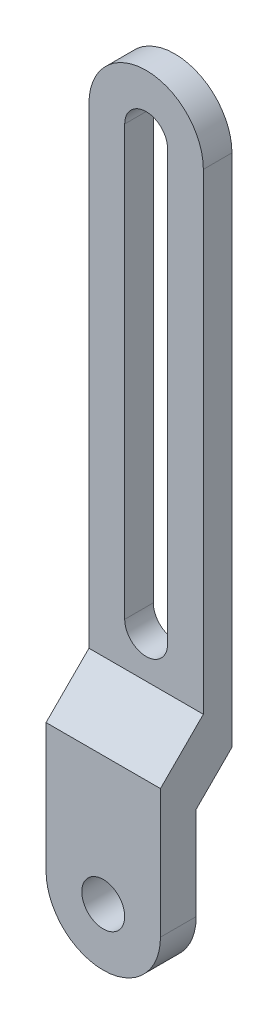
ISO-10303-21;
HEADER;
FILE_DESCRIPTION(('STEP AP214'),'2;1');
FILE_NAME('part.step','',(''),(''),'','','');
FILE_SCHEMA(('AUTOMOTIVE_DESIGN { 1 0 10303 214 1 1 1 1 }'));
ENDSEC;
DATA;
#1=APPLICATION_CONTEXT('core data for automotive mechanical design processes');
#2=APPLICATION_PROTOCOL_DEFINITION('international standard','automotive_design',2000,#1);
#3=PRODUCT_CONTEXT('',#1,'mechanical');
#4=PRODUCT('Part','Part','',(#3));
#5=PRODUCT_RELATED_PRODUCT_CATEGORY('part','',(#4));
#6=PRODUCT_DEFINITION_FORMATION('','',#4);
#7=PRODUCT_DEFINITION_CONTEXT('part definition',#1,'design');
#8=PRODUCT_DEFINITION('design','',#6,#7);
#9=PRODUCT_DEFINITION_SHAPE('','',#8);
#10=(LENGTH_UNIT() NAMED_UNIT(*) SI_UNIT(.MILLI.,.METRE.));
#11=(NAMED_UNIT(*) PLANE_ANGLE_UNIT() SI_UNIT($,.RADIAN.));
#12=(NAMED_UNIT(*) SI_UNIT($,.STERADIAN.) SOLID_ANGLE_UNIT());
#13=UNCERTAINTY_MEASURE_WITH_UNIT(LENGTH_MEASURE(1.E-05),#10,'distance_accuracy_value','');
#14=(GEOMETRIC_REPRESENTATION_CONTEXT(3) GLOBAL_UNCERTAINTY_ASSIGNED_CONTEXT((#13)) GLOBAL_UNIT_ASSIGNED_CONTEXT((#10,
#11,#12)) REPRESENTATION_CONTEXT('',''));
#15=CARTESIAN_POINT('',(0.,0.,0.));
#16=DIRECTION('',(0.,0.,1.));
#17=DIRECTION('',(1.,0.,0.));
#18=AXIS2_PLACEMENT_3D('',#15,#16,#17);
#19=CARTESIAN_POINT('',(0.,0.,2.));
#20=DIRECTION('',(0.,0.,-1.));
#21=DIRECTION('',(-1.,0.,0.));
#22=AXIS2_PLACEMENT_3D('',#19,#20,#21);
#23=CYLINDRICAL_SURFACE('',#22,4.);
#24=CARTESIAN_POINT('',(0.,0.,2.5));
#25=DIRECTION('',(0.,0.,-1.));
#26=DIRECTION('',(-1.,0.,0.));
#27=AXIS2_PLACEMENT_3D('',#24,#25,#26);
#28=CIRCLE('',#27,4.);
#29=CARTESIAN_POINT('',(4.,0.,2.5));
#30=VERTEX_POINT('',#29);
#31=CARTESIAN_POINT('',(-4.,0.,2.5));
#32=VERTEX_POINT('',#31);
#33=EDGE_CURVE('E129',#30,#32,#28,.T.);
#34=ORIENTED_EDGE('',*,*,#33,.F.);
#35=DIRECTION('',(0.,0.,-1.));
#36=VECTOR('',#35,1.);
#37=CARTESIAN_POINT('',(4.,0.,2.));
#38=LINE('',#37,#36);
#39=CARTESIAN_POINT('',(4.,0.,5.));
#40=VERTEX_POINT('',#39);
#41=EDGE_CURVE('E137',#40,#30,#38,.T.);
#42=ORIENTED_EDGE('',*,*,#41,.F.);
#43=CARTESIAN_POINT('',(0.,0.,5.));
#44=DIRECTION('',(0.,0.,1.));
#45=DIRECTION('',(1.,0.,0.));
#46=AXIS2_PLACEMENT_3D('',#43,#44,#45);
#47=CIRCLE('',#46,4.);
#48=CARTESIAN_POINT('',(-4.,0.,5.));
#49=VERTEX_POINT('',#48);
#50=EDGE_CURVE('E216',#49,#40,#47,.T.);
#51=ORIENTED_EDGE('',*,*,#50,.F.);
#52=DIRECTION('',(0.,0.,-1.));
#53=VECTOR('',#52,1.);
#54=CARTESIAN_POINT('',(-4.,0.,2.));
#55=LINE('',#54,#53);
#56=EDGE_CURVE('E139',#49,#32,#55,.T.);
#57=ORIENTED_EDGE('',*,*,#56,.T.);
#58=EDGE_LOOP('',(#34,#42,#51,#57));
#59=FACE_BOUND('',#58,.T.);
#60=ADVANCED_FACE('F33',(#59),#23,.T.);
#61=CARTESIAN_POINT('',(0.,0.,2.));
#62=DIRECTION('',(0.,0.,-1.));
#63=DIRECTION('',(-1.,0.,0.));
#64=AXIS2_PLACEMENT_3D('',#61,#62,#63);
#65=CYLINDRICAL_SURFACE('',#64,1.5);
#66=CARTESIAN_POINT('',(0.,0.,5.));
#67=DIRECTION('',(0.,0.,1.));
#68=DIRECTION('',(1.,0.,0.));
#69=AXIS2_PLACEMENT_3D('',#66,#67,#68);
#70=CIRCLE('',#69,1.5);
#71=CARTESIAN_POINT('',(1.5,0.,5.));
#72=VERTEX_POINT('',#71);
#73=EDGE_CURVE('E158',#72,#72,#70,.T.);
#74=ORIENTED_EDGE('',*,*,#73,.T.);
#75=EDGE_LOOP('',(#74));
#76=FACE_BOUND('',#75,.T.);
#77=CARTESIAN_POINT('',(0.,0.,2.5));
#78=DIRECTION('',(0.,0.,-1.));
#79=DIRECTION('',(-1.,0.,0.));
#80=AXIS2_PLACEMENT_3D('',#77,#78,#79);
#81=CIRCLE('',#80,1.5);
#82=CARTESIAN_POINT('',(-1.5,0.,2.5));
#83=VERTEX_POINT('',#82);
#84=EDGE_CURVE('E156',#83,#83,#81,.T.);
#85=ORIENTED_EDGE('',*,*,#84,.T.);
#86=EDGE_LOOP('',(#85));
#87=FACE_BOUND('',#86,.T.);
#88=ADVANCED_FACE('F184',(#76,#87),#65,.F.);
#89=CARTESIAN_POINT('',(0.,0.,2.));
#90=DIRECTION('',(0.,0.,1.));
#91=DIRECTION('',(1.,0.,0.));
#92=AXIS2_PLACEMENT_3D('',#89,#90,#91);
#93=PLANE('',#92);
#94=DIRECTION('',(0.,-1.,0.));
#95=VECTOR('',#94,1.);
#96=CARTESIAN_POINT('',(-4.,0.,2.));
#97=LINE('',#96,#95);
#98=CARTESIAN_POINT('',(-4.,45.,2.));
#99=VERTEX_POINT('',#98);
#100=CARTESIAN_POINT('',(-4.,12.,2.));
#101=VERTEX_POINT('',#100);
#102=EDGE_CURVE('E259',#99,#101,#97,.T.);
#103=ORIENTED_EDGE('',*,*,#102,.T.);
#104=DIRECTION('',(1.,0.,0.));
#105=VECTOR('',#104,1.);
#106=CARTESIAN_POINT('',(0.,12.,2.));
#107=LINE('',#106,#105);
#108=CARTESIAN_POINT('',(4.,12.,2.));
#109=VERTEX_POINT('',#108);
#110=EDGE_CURVE('E146',#101,#109,#107,.T.);
#111=ORIENTED_EDGE('',*,*,#110,.T.);
#112=DIRECTION('',(0.,1.,0.));
#113=VECTOR('',#112,1.);
#114=CARTESIAN_POINT('',(4.,0.,2.));
#115=LINE('',#114,#113);
#116=CARTESIAN_POINT('',(4.,45.,2.));
#117=VERTEX_POINT('',#116);
#118=EDGE_CURVE('E211',#109,#117,#115,.T.);
#119=ORIENTED_EDGE('',*,*,#118,.T.);
#120=CARTESIAN_POINT('',(0.,45.,2.));
#121=DIRECTION('',(0.,0.,1.));
#122=DIRECTION('',(1.,0.,0.));
#123=AXIS2_PLACEMENT_3D('',#120,#121,#122);
#124=CIRCLE('',#123,4.);
#125=EDGE_CURVE('E256',#117,#99,#124,.T.);
#126=ORIENTED_EDGE('',*,*,#125,.T.);
#127=EDGE_LOOP('',(#103,#111,#119,#126));
#128=FACE_BOUND('',#127,.T.);
#129=DIRECTION('',(0.,-1.,0.));
#130=VECTOR('',#129,1.);
#131=CARTESIAN_POINT('',(-1.5,45.,2.));
#132=LINE('',#131,#130);
#133=CARTESIAN_POINT('',(-1.5,45.,2.));
#134=VERTEX_POINT('',#133);
#135=CARTESIAN_POINT('',(-1.5,15.,2.));
#136=VERTEX_POINT('',#135);
#137=EDGE_CURVE('E226',#134,#136,#132,.T.);
#138=ORIENTED_EDGE('',*,*,#137,.F.);
#139=CARTESIAN_POINT('',(0.,45.,2.));
#140=DIRECTION('',(0.,0.,1.));
#141=DIRECTION('',(1.,0.,0.));
#142=AXIS2_PLACEMENT_3D('',#139,#140,#141);
#143=CIRCLE('',#142,1.5);
#144=CARTESIAN_POINT('',(1.5,45.,2.));
#145=VERTEX_POINT('',#144);
#146=EDGE_CURVE('E224',#145,#134,#143,.T.);
#147=ORIENTED_EDGE('',*,*,#146,.F.);
#148=DIRECTION('',(0.,1.,0.));
#149=VECTOR('',#148,1.);
#150=CARTESIAN_POINT('',(1.5,45.,2.));
#151=LINE('',#150,#149);
#152=CARTESIAN_POINT('',(1.5,15.,2.));
#153=VERTEX_POINT('',#152);
#154=EDGE_CURVE('E232',#153,#145,#151,.T.);
#155=ORIENTED_EDGE('',*,*,#154,.F.);
#156=CARTESIAN_POINT('',(0.,15.,2.));
#157=DIRECTION('',(0.,0.,1.));
#158=DIRECTION('',(1.,0.,0.));
#159=AXIS2_PLACEMENT_3D('',#156,#157,#158);
#160=CIRCLE('',#159,1.5);
#161=EDGE_CURVE('E229',#136,#153,#160,.T.);
#162=ORIENTED_EDGE('',*,*,#161,.F.);
#163=EDGE_LOOP('',(#138,#147,#155,#162));
#164=FACE_BOUND('',#163,.T.);
#165=ADVANCED_FACE('F189',(#128,#164),#93,.T.);
#166=CARTESIAN_POINT('',(0.,0.,0.));
#167=DIRECTION('',(0.,0.,1.));
#168=DIRECTION('',(1.,0.,0.));
#169=AXIS2_PLACEMENT_3D('',#166,#167,#168);
#170=PLANE('',#169);
#171=DIRECTION('',(0.,1.,0.));
#172=VECTOR('',#171,1.);
#173=CARTESIAN_POINT('',(4.,0.,0.));
#174=LINE('',#173,#172);
#175=CARTESIAN_POINT('',(4.,9.00000000000001,0.));
#176=VERTEX_POINT('',#175);
#177=CARTESIAN_POINT('',(4.,45.,0.));
#178=VERTEX_POINT('',#177);
#179=EDGE_CURVE('E254',#176,#178,#174,.T.);
#180=ORIENTED_EDGE('',*,*,#179,.F.);
#181=DIRECTION('',(-1.,0.,0.));
#182=VECTOR('',#181,1.);
#183=CARTESIAN_POINT('',(0.,9.00000000000001,0.));
#184=LINE('',#183,#182);
#185=CARTESIAN_POINT('',(-4.,9.00000000000001,0.));
#186=VERTEX_POINT('',#185);
#187=EDGE_CURVE('E167',#176,#186,#184,.T.);
#188=ORIENTED_EDGE('',*,*,#187,.T.);
#189=DIRECTION('',(0.,-1.,0.));
#190=VECTOR('',#189,1.);
#191=CARTESIAN_POINT('',(-4.,0.,0.));
#192=LINE('',#191,#190);
#193=CARTESIAN_POINT('',(-4.,45.,0.));
#194=VERTEX_POINT('',#193);
#195=EDGE_CURVE('E257',#194,#186,#192,.T.);
#196=ORIENTED_EDGE('',*,*,#195,.F.);
#197=CARTESIAN_POINT('',(0.,45.,0.));
#198=DIRECTION('',(0.,0.,1.));
#199=DIRECTION('',(1.,0.,0.));
#200=AXIS2_PLACEMENT_3D('',#197,#198,#199);
#201=CIRCLE('',#200,4.);
#202=EDGE_CURVE('E263',#178,#194,#201,.T.);
#203=ORIENTED_EDGE('',*,*,#202,.F.);
#204=EDGE_LOOP('',(#180,#188,#196,#203));
#205=FACE_BOUND('',#204,.T.);
#206=CARTESIAN_POINT('',(0.,45.,0.));
#207=DIRECTION('',(0.,0.,1.));
#208=DIRECTION('',(1.,0.,0.));
#209=AXIS2_PLACEMENT_3D('',#206,#207,#208);
#210=CIRCLE('',#209,1.5);
#211=CARTESIAN_POINT('',(1.5,45.,0.));
#212=VERTEX_POINT('',#211);
#213=CARTESIAN_POINT('',(-1.5,45.,0.));
#214=VERTEX_POINT('',#213);
#215=EDGE_CURVE('E218',#212,#214,#210,.T.);
#216=ORIENTED_EDGE('',*,*,#215,.T.);
#217=DIRECTION('',(0.,-1.,0.));
#218=VECTOR('',#217,1.);
#219=CARTESIAN_POINT('',(-1.5,45.,0.));
#220=LINE('',#219,#218);
#221=CARTESIAN_POINT('',(-1.5,15.,0.));
#222=VERTEX_POINT('',#221);
#223=EDGE_CURVE('E237',#214,#222,#220,.T.);
#224=ORIENTED_EDGE('',*,*,#223,.T.);
#225=CARTESIAN_POINT('',(0.,15.,0.));
#226=DIRECTION('',(0.,0.,1.));
#227=DIRECTION('',(1.,0.,0.));
#228=AXIS2_PLACEMENT_3D('',#225,#226,#227);
#229=CIRCLE('',#228,1.5);
#230=CARTESIAN_POINT('',(1.5,15.,0.));
#231=VERTEX_POINT('',#230);
#232=EDGE_CURVE('E240',#222,#231,#229,.T.);
#233=ORIENTED_EDGE('',*,*,#232,.T.);
#234=DIRECTION('',(0.,1.,0.));
#235=VECTOR('',#234,1.);
#236=CARTESIAN_POINT('',(1.5,45.,0.));
#237=LINE('',#236,#235);
#238=EDGE_CURVE('E227',#231,#212,#237,.T.);
#239=ORIENTED_EDGE('',*,*,#238,.T.);
#240=EDGE_LOOP('',(#216,#224,#233,#239));
#241=FACE_BOUND('',#240,.T.);
#242=ADVANCED_FACE('F276',(#205,#241),#170,.F.);
#243=CARTESIAN_POINT('',(4.,0.,2.));
#244=DIRECTION('',(-1.,0.,0.));
#245=DIRECTION('',(0.,0.,1.));
#246=AXIS2_PLACEMENT_3D('',#243,#244,#245);
#247=PLANE('',#246);
#248=DIRECTION('',(0.,-1.,0.));
#249=VECTOR('',#248,1.);
#250=CARTESIAN_POINT('',(4.,7.,2.5));
#251=LINE('',#250,#249);
#252=CARTESIAN_POINT('',(4.,6.49999999999998,2.5));
#253=VERTEX_POINT('',#252);
#254=EDGE_CURVE('E126',#253,#30,#251,.T.);
#255=ORIENTED_EDGE('',*,*,#254,.F.);
#256=DIRECTION('',(0.,0.707106781186553,-0.707106781186542));
#257=VECTOR('',#256,1.);
#258=CARTESIAN_POINT('',(4.,3.49999999999995,5.5));
#259=LINE('',#258,#257);
#260=CARTESIAN_POINT('',(4.,7.,2.));
#261=VERTEX_POINT('',#260);
#262=EDGE_CURVE('E41',#253,#261,#259,.T.);
#263=ORIENTED_EDGE('',*,*,#262,.T.);
#264=DIRECTION('',(0.,-0.707106781186549,0.707106781186546));
#265=VECTOR('',#264,1.);
#266=CARTESIAN_POINT('',(4.,7.,2.));
#267=LINE('',#266,#265);
#268=EDGE_CURVE('E165',#261,#176,#267,.F.);
#269=ORIENTED_EDGE('',*,*,#268,.T.);
#270=ORIENTED_EDGE('',*,*,#179,.T.);
#271=DIRECTION('',(0.,0.,-1.));
#272=VECTOR('',#271,1.);
#273=CARTESIAN_POINT('',(4.,45.,2.));
#274=LINE('',#273,#272);
#275=EDGE_CURVE('E147',#117,#178,#274,.T.);
#276=ORIENTED_EDGE('',*,*,#275,.F.);
#277=ORIENTED_EDGE('',*,*,#118,.F.);
#278=DIRECTION('',(0.,-0.707106781186544,0.707106781186552));
#279=VECTOR('',#278,1.);
#280=CARTESIAN_POINT('',(4.,6.00000000000007,8.));
#281=LINE('',#280,#279);
#282=CARTESIAN_POINT('',(4.,9.,5.));
#283=VERTEX_POINT('',#282);
#284=EDGE_CURVE('E161',#109,#283,#281,.T.);
#285=ORIENTED_EDGE('',*,*,#284,.T.);
#286=DIRECTION('',(0.,1.,0.));
#287=VECTOR('',#286,1.);
#288=CARTESIAN_POINT('',(4.,9.,5.));
#289=LINE('',#288,#287);
#290=EDGE_CURVE('E145',#40,#283,#289,.T.);
#291=ORIENTED_EDGE('',*,*,#290,.F.);
#292=ORIENTED_EDGE('',*,*,#41,.T.);
#293=EDGE_LOOP('',(#255,#263,#269,#270,#276,#277,#285,#291,#292));
#294=FACE_BOUND('',#293,.T.);
#295=ADVANCED_FACE('F143',(#294),#247,.F.);
#296=CARTESIAN_POINT('',(0.,45.,2.));
#297=DIRECTION('',(0.,0.,-1.));
#298=DIRECTION('',(-1.,0.,0.));
#299=AXIS2_PLACEMENT_3D('',#296,#297,#298);
#300=CYLINDRICAL_SURFACE('',#299,4.);
#301=ORIENTED_EDGE('',*,*,#202,.T.);
#302=DIRECTION('',(0.,0.,-1.));
#303=VECTOR('',#302,1.);
#304=CARTESIAN_POINT('',(-4.,45.,2.));
#305=LINE('',#304,#303);
#306=EDGE_CURVE('E152',#99,#194,#305,.T.);
#307=ORIENTED_EDGE('',*,*,#306,.F.);
#308=ORIENTED_EDGE('',*,*,#125,.F.);
#309=ORIENTED_EDGE('',*,*,#275,.T.);
#310=EDGE_LOOP('',(#301,#307,#308,#309));
#311=FACE_BOUND('',#310,.T.);
#312=ADVANCED_FACE('F278',(#311),#300,.T.);
#313=CARTESIAN_POINT('',(-4.,0.,2.));
#314=DIRECTION('',(1.,0.,0.));
#315=DIRECTION('',(0.,0.,-1.));
#316=AXIS2_PLACEMENT_3D('',#313,#314,#315);
#317=PLANE('',#316);
#318=ORIENTED_EDGE('',*,*,#195,.T.);
#319=DIRECTION('',(0.,0.707106781186549,-0.707106781186546));
#320=VECTOR('',#319,1.);
#321=CARTESIAN_POINT('',(-4.,7.,2.));
#322=LINE('',#321,#320);
#323=CARTESIAN_POINT('',(-4.,7.,2.));
#324=VERTEX_POINT('',#323);
#325=EDGE_CURVE('E169',#186,#324,#322,.F.);
#326=ORIENTED_EDGE('',*,*,#325,.T.);
#327=DIRECTION('',(0.,-0.707106781186553,0.707106781186542));
#328=VECTOR('',#327,1.);
#329=CARTESIAN_POINT('',(-4.,3.49999999999995,5.5));
#330=LINE('',#329,#328);
#331=CARTESIAN_POINT('',(-4.,6.49999999999998,2.5));
#332=VERTEX_POINT('',#331);
#333=EDGE_CURVE('E11',#324,#332,#330,.T.);
#334=ORIENTED_EDGE('',*,*,#333,.T.);
#335=DIRECTION('',(0.,1.,0.));
#336=VECTOR('',#335,1.);
#337=CARTESIAN_POINT('',(-4.,7.,2.5));
#338=LINE('',#337,#336);
#339=EDGE_CURVE('E140',#32,#332,#338,.T.);
#340=ORIENTED_EDGE('',*,*,#339,.F.);
#341=ORIENTED_EDGE('',*,*,#56,.F.);
#342=DIRECTION('',(0.,-1.,0.));
#343=VECTOR('',#342,1.);
#344=CARTESIAN_POINT('',(-4.,9.,5.));
#345=LINE('',#344,#343);
#346=CARTESIAN_POINT('',(-4.,9.,5.));
#347=VERTEX_POINT('',#346);
#348=EDGE_CURVE('E220',#347,#49,#345,.T.);
#349=ORIENTED_EDGE('',*,*,#348,.F.);
#350=DIRECTION('',(0.,0.707106781186544,-0.707106781186552));
#351=VECTOR('',#350,1.);
#352=CARTESIAN_POINT('',(-4.,6.00000000000007,8.));
#353=LINE('',#352,#351);
#354=EDGE_CURVE('E149',#347,#101,#353,.T.);
#355=ORIENTED_EDGE('',*,*,#354,.T.);
#356=ORIENTED_EDGE('',*,*,#102,.F.);
#357=ORIENTED_EDGE('',*,*,#306,.T.);
#358=EDGE_LOOP('',(#318,#326,#334,#340,#341,#349,#355,#356,#357));
#359=FACE_BOUND('',#358,.T.);
#360=ADVANCED_FACE('F271',(#359),#317,.F.);
#361=CARTESIAN_POINT('',(0.,45.,2.));
#362=DIRECTION('',(0.,0.,-1.));
#363=DIRECTION('',(-1.,0.,0.));
#364=AXIS2_PLACEMENT_3D('',#361,#362,#363);
#365=CYLINDRICAL_SURFACE('',#364,1.5);
#366=ORIENTED_EDGE('',*,*,#215,.F.);
#367=DIRECTION('',(0.,0.,-1.));
#368=VECTOR('',#367,1.);
#369=CARTESIAN_POINT('',(1.5,45.,2.));
#370=LINE('',#369,#368);
#371=EDGE_CURVE('E234',#145,#212,#370,.T.);
#372=ORIENTED_EDGE('',*,*,#371,.F.);
#373=ORIENTED_EDGE('',*,*,#146,.T.);
#374=DIRECTION('',(0.,0.,-1.));
#375=VECTOR('',#374,1.);
#376=CARTESIAN_POINT('',(-1.5,45.,2.));
#377=LINE('',#376,#375);
#378=EDGE_CURVE('E251',#134,#214,#377,.T.);
#379=ORIENTED_EDGE('',*,*,#378,.T.);
#380=EDGE_LOOP('',(#366,#372,#373,#379));
#381=FACE_BOUND('',#380,.T.);
#382=ADVANCED_FACE('F296',(#381),#365,.F.);
#383=CARTESIAN_POINT('',(-1.5,45.,2.));
#384=DIRECTION('',(1.,0.,0.));
#385=DIRECTION('',(0.,1.,0.));
#386=AXIS2_PLACEMENT_3D('',#383,#384,#385);
#387=PLANE('',#386);
#388=ORIENTED_EDGE('',*,*,#223,.F.);
#389=ORIENTED_EDGE('',*,*,#378,.F.);
#390=ORIENTED_EDGE('',*,*,#137,.T.);
#391=DIRECTION('',(0.,0.,-1.));
#392=VECTOR('',#391,1.);
#393=CARTESIAN_POINT('',(-1.5,15.,2.));
#394=LINE('',#393,#392);
#395=EDGE_CURVE('E249',#136,#222,#394,.T.);
#396=ORIENTED_EDGE('',*,*,#395,.T.);
#397=EDGE_LOOP('',(#388,#389,#390,#396));
#398=FACE_BOUND('',#397,.T.);
#399=ADVANCED_FACE('F290',(#398),#387,.T.);
#400=CARTESIAN_POINT('',(0.,15.,2.));
#401=DIRECTION('',(0.,0.,-1.));
#402=DIRECTION('',(-1.,0.,0.));
#403=AXIS2_PLACEMENT_3D('',#400,#401,#402);
#404=CYLINDRICAL_SURFACE('',#403,1.5);
#405=ORIENTED_EDGE('',*,*,#232,.F.);
#406=ORIENTED_EDGE('',*,*,#395,.F.);
#407=ORIENTED_EDGE('',*,*,#161,.T.);
#408=DIRECTION('',(0.,0.,-1.));
#409=VECTOR('',#408,1.);
#410=CARTESIAN_POINT('',(1.5,15.,2.));
#411=LINE('',#410,#409);
#412=EDGE_CURVE('E247',#153,#231,#411,.T.);
#413=ORIENTED_EDGE('',*,*,#412,.T.);
#414=EDGE_LOOP('',(#405,#406,#407,#413));
#415=FACE_BOUND('',#414,.T.);
#416=ADVANCED_FACE('F293',(#415),#404,.F.);
#417=CARTESIAN_POINT('',(1.5,45.,2.));
#418=DIRECTION('',(-1.,0.,0.));
#419=DIRECTION('',(0.,-1.,0.));
#420=AXIS2_PLACEMENT_3D('',#417,#418,#419);
#421=PLANE('',#420);
#422=ORIENTED_EDGE('',*,*,#238,.F.);
#423=ORIENTED_EDGE('',*,*,#412,.F.);
#424=ORIENTED_EDGE('',*,*,#154,.T.);
#425=ORIENTED_EDGE('',*,*,#371,.T.);
#426=EDGE_LOOP('',(#422,#423,#424,#425));
#427=FACE_BOUND('',#426,.T.);
#428=ADVANCED_FACE('F299',(#427),#421,.T.);
#429=CARTESIAN_POINT('',(0.,0.,5.));
#430=DIRECTION('',(0.,0.,1.));
#431=DIRECTION('',(1.,0.,0.));
#432=AXIS2_PLACEMENT_3D('',#429,#430,#431);
#433=PLANE('',#432);
#434=ORIENTED_EDGE('',*,*,#348,.T.);
#435=ORIENTED_EDGE('',*,*,#50,.T.);
#436=ORIENTED_EDGE('',*,*,#290,.T.);
#437=DIRECTION('',(-1.,0.,0.));
#438=VECTOR('',#437,1.);
#439=CARTESIAN_POINT('',(-4.,9.,5.));
#440=LINE('',#439,#438);
#441=EDGE_CURVE('E208',#283,#347,#440,.T.);
#442=ORIENTED_EDGE('',*,*,#441,.T.);
#443=EDGE_LOOP('',(#434,#435,#436,#442));
#444=FACE_BOUND('',#443,.T.);
#445=ORIENTED_EDGE('',*,*,#73,.F.);
#446=EDGE_LOOP('',(#445));
#447=FACE_BOUND('',#446,.T.);
#448=ADVANCED_FACE('F201',(#444,#447),#433,.T.);
#449=CARTESIAN_POINT('',(0.,0.,2.5));
#450=DIRECTION('',(0.,0.,-1.));
#451=DIRECTION('',(-1.,0.,0.));
#452=AXIS2_PLACEMENT_3D('',#449,#450,#451);
#453=PLANE('',#452);
#454=ORIENTED_EDGE('',*,*,#84,.F.);
#455=EDGE_LOOP('',(#454));
#456=FACE_BOUND('',#455,.T.);
#457=ORIENTED_EDGE('',*,*,#339,.T.);
#458=DIRECTION('',(1.,0.,0.));
#459=VECTOR('',#458,1.);
#460=CARTESIAN_POINT('',(0.,6.49999999999998,2.5));
#461=LINE('',#460,#459);
#462=EDGE_CURVE('E130',#332,#253,#461,.T.);
#463=ORIENTED_EDGE('',*,*,#462,.T.);
#464=ORIENTED_EDGE('',*,*,#254,.T.);
#465=ORIENTED_EDGE('',*,*,#33,.T.);
#466=EDGE_LOOP('',(#457,#463,#464,#465));
#467=FACE_BOUND('',#466,.T.);
#468=ADVANCED_FACE('F128',(#456,#467),#453,.T.);
#469=CARTESIAN_POINT('',(-4.,9.,5.00000000000003));
#470=DIRECTION('',(0.,-0.707106781186552,-0.707106781186544));
#471=DIRECTION('',(-1.,0.,0.));
#472=AXIS2_PLACEMENT_3D('',#469,#470,#471);
#473=PLANE('',#472);
#474=ORIENTED_EDGE('',*,*,#284,.F.);
#475=ORIENTED_EDGE('',*,*,#110,.F.);
#476=ORIENTED_EDGE('',*,*,#354,.F.);
#477=ORIENTED_EDGE('',*,*,#441,.F.);
#478=EDGE_LOOP('',(#474,#475,#476,#477));
#479=FACE_BOUND('',#478,.T.);
#480=ADVANCED_FACE('F182',(#479),#473,.F.);
#481=CARTESIAN_POINT('',(4.,7.,2.));
#482=DIRECTION('',(0.,0.707106781186546,0.707106781186549));
#483=DIRECTION('',(1.,0.,0.));
#484=AXIS2_PLACEMENT_3D('',#481,#482,#483);
#485=PLANE('',#484);
#486=ORIENTED_EDGE('',*,*,#325,.F.);
#487=ORIENTED_EDGE('',*,*,#187,.F.);
#488=ORIENTED_EDGE('',*,*,#268,.F.);
#489=DIRECTION('',(1.,0.,0.));
#490=VECTOR('',#489,1.);
#491=CARTESIAN_POINT('',(4.,7.,2.));
#492=LINE('',#491,#490);
#493=EDGE_CURVE('E163',#324,#261,#492,.T.);
#494=ORIENTED_EDGE('',*,*,#493,.F.);
#495=EDGE_LOOP('',(#486,#487,#488,#494));
#496=FACE_BOUND('',#495,.T.);
#497=ADVANCED_FACE('F177',(#496),#485,.F.);
#498=CARTESIAN_POINT('',(0.,6.49999999999998,2.5));
#499=DIRECTION('',(0.,0.707106781186542,0.707106781186553));
#500=DIRECTION('',(1.,0.,0.));
#501=AXIS2_PLACEMENT_3D('',#498,#499,#500);
#502=PLANE('',#501);
#503=ORIENTED_EDGE('',*,*,#333,.F.);
#504=ORIENTED_EDGE('',*,*,#493,.T.);
#505=ORIENTED_EDGE('',*,*,#262,.F.);
#506=ORIENTED_EDGE('',*,*,#462,.F.);
#507=EDGE_LOOP('',(#503,#504,#505,#506));
#508=FACE_BOUND('',#507,.T.);
#509=ADVANCED_FACE('F35',(#508),#502,.F.);
#510=CLOSED_SHELL('',(#60,#88,#165,#242,#295,#312,#360,#382,#399,#416,#428,#448,#468,#480,#497,#509));
#511=MANIFOLD_SOLID_BREP('B2',#510);
#512=ADVANCED_BREP_SHAPE_REPRESENTATION('',(#18,#511),#14);
#513=SHAPE_DEFINITION_REPRESENTATION(#9,#512);
ENDSEC;
END-ISO-10303-21;
